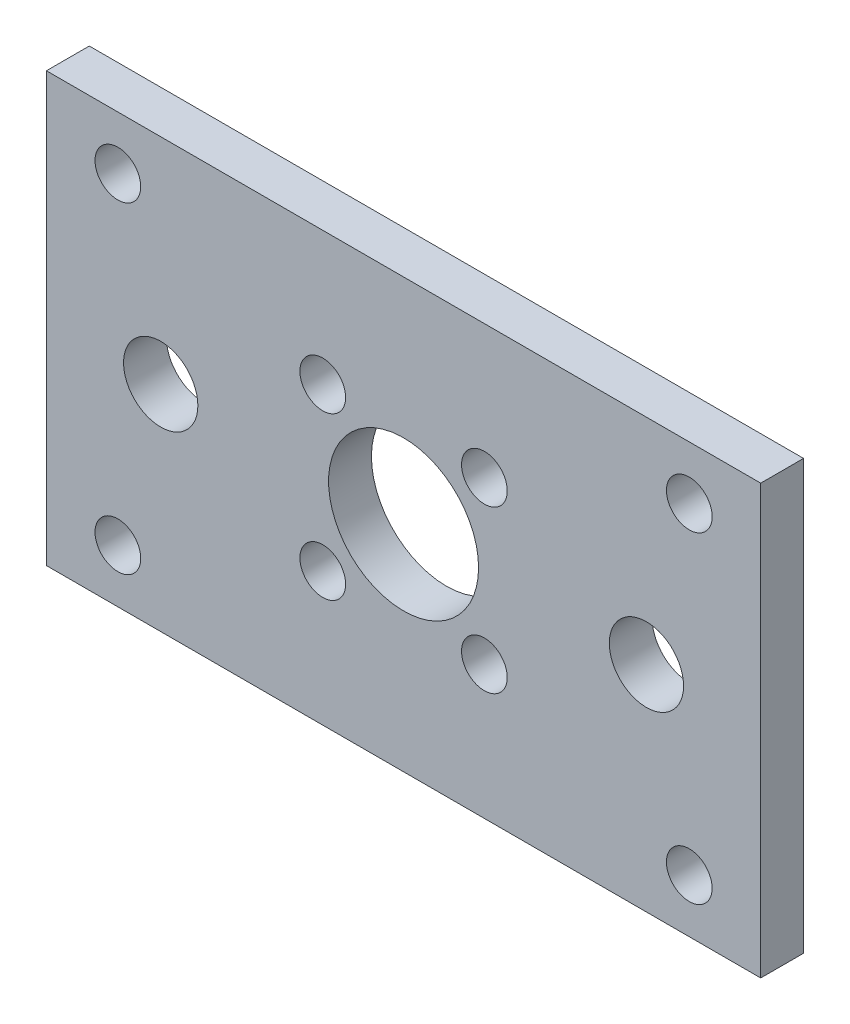
ISO-10303-21;
HEADER;
FILE_DESCRIPTION(('STEP AP214'),'2;1');
FILE_NAME('part.step','',(''),(''),'','','');
FILE_SCHEMA(('AUTOMOTIVE_DESIGN { 1 0 10303 214 1 1 1 1 }'));
ENDSEC;
DATA;
#1=APPLICATION_CONTEXT('core data for automotive mechanical design processes');
#2=APPLICATION_PROTOCOL_DEFINITION('international standard','automotive_design',2000,#1);
#3=PRODUCT_CONTEXT('',#1,'mechanical');
#4=PRODUCT('Part','Part','',(#3));
#5=PRODUCT_RELATED_PRODUCT_CATEGORY('part','',(#4));
#6=PRODUCT_DEFINITION_FORMATION('','',#4);
#7=PRODUCT_DEFINITION_CONTEXT('part definition',#1,'design');
#8=PRODUCT_DEFINITION('design','',#6,#7);
#9=PRODUCT_DEFINITION_SHAPE('','',#8);
#10=(LENGTH_UNIT() NAMED_UNIT(*) SI_UNIT(.MILLI.,.METRE.));
#11=(NAMED_UNIT(*) PLANE_ANGLE_UNIT() SI_UNIT($,.RADIAN.));
#12=(NAMED_UNIT(*) SI_UNIT($,.STERADIAN.) SOLID_ANGLE_UNIT());
#13=UNCERTAINTY_MEASURE_WITH_UNIT(LENGTH_MEASURE(1.E-05),#10,'distance_accuracy_value','');
#14=(GEOMETRIC_REPRESENTATION_CONTEXT(3) GLOBAL_UNCERTAINTY_ASSIGNED_CONTEXT((#13)) GLOBAL_UNIT_ASSIGNED_CONTEXT((#10,
#11,#12)) REPRESENTATION_CONTEXT('',''));
#15=CARTESIAN_POINT('',(0.,0.,0.));
#16=DIRECTION('',(0.,0.,1.));
#17=DIRECTION('',(1.,0.,0.));
#18=AXIS2_PLACEMENT_3D('',#15,#16,#17);
#19=CARTESIAN_POINT('',(50.,0.,3.));
#20=DIRECTION('',(0.,1.,0.));
#21=DIRECTION('',(0.,0.,1.));
#22=AXIS2_PLACEMENT_3D('',#19,#20,#21);
#23=PLANE('',#22);
#24=DIRECTION('',(1.,0.,0.));
#25=VECTOR('',#24,1.);
#26=CARTESIAN_POINT('',(50.,0.,0.));
#27=LINE('',#26,#25);
#28=CARTESIAN_POINT('',(0.,0.,0.));
#29=VERTEX_POINT('',#28);
#30=CARTESIAN_POINT('',(50.,0.,0.));
#31=VERTEX_POINT('',#30);
#32=EDGE_CURVE('E107',#29,#31,#27,.T.);
#33=ORIENTED_EDGE('',*,*,#32,.T.);
#34=DIRECTION('',(0.,0.,-1.));
#35=VECTOR('',#34,1.);
#36=CARTESIAN_POINT('',(50.,0.,3.));
#37=LINE('',#36,#35);
#38=CARTESIAN_POINT('',(50.,0.,3.));
#39=VERTEX_POINT('',#38);
#40=EDGE_CURVE('E11',#39,#31,#37,.T.);
#41=ORIENTED_EDGE('',*,*,#40,.F.);
#42=DIRECTION('',(1.,0.,0.));
#43=VECTOR('',#42,1.);
#44=CARTESIAN_POINT('',(50.,0.,3.));
#45=LINE('',#44,#43);
#46=CARTESIAN_POINT('',(0.,0.,3.));
#47=VERTEX_POINT('',#46);
#48=EDGE_CURVE('E94',#47,#39,#45,.T.);
#49=ORIENTED_EDGE('',*,*,#48,.F.);
#50=DIRECTION('',(0.,0.,-1.));
#51=VECTOR('',#50,1.);
#52=CARTESIAN_POINT('',(0.,0.,3.));
#53=LINE('',#52,#51);
#54=EDGE_CURVE('E103',#47,#29,#53,.T.);
#55=ORIENTED_EDGE('',*,*,#54,.T.);
#56=EDGE_LOOP('',(#33,#41,#49,#55));
#57=FACE_BOUND('',#56,.T.);
#58=ADVANCED_FACE('F41',(#57),#23,.F.);
#59=CARTESIAN_POINT('',(50.,0.,3.));
#60=DIRECTION('',(-1.,0.,0.));
#61=DIRECTION('',(0.,0.,1.));
#62=AXIS2_PLACEMENT_3D('',#59,#60,#61);
#63=PLANE('',#62);
#64=DIRECTION('',(0.,1.,0.));
#65=VECTOR('',#64,1.);
#66=CARTESIAN_POINT('',(50.,0.,0.));
#67=LINE('',#66,#65);
#68=CARTESIAN_POINT('',(50.,30.,0.));
#69=VERTEX_POINT('',#68);
#70=EDGE_CURVE('E98',#31,#69,#67,.T.);
#71=ORIENTED_EDGE('',*,*,#70,.T.);
#72=DIRECTION('',(0.,0.,-1.));
#73=VECTOR('',#72,1.);
#74=CARTESIAN_POINT('',(50.,30.,3.));
#75=LINE('',#74,#73);
#76=CARTESIAN_POINT('',(50.,30.,3.));
#77=VERTEX_POINT('',#76);
#78=EDGE_CURVE('E50',#77,#69,#75,.T.);
#79=ORIENTED_EDGE('',*,*,#78,.F.);
#80=DIRECTION('',(0.,1.,0.));
#81=VECTOR('',#80,1.);
#82=CARTESIAN_POINT('',(50.,0.,3.));
#83=LINE('',#82,#81);
#84=EDGE_CURVE('E89',#39,#77,#83,.T.);
#85=ORIENTED_EDGE('',*,*,#84,.F.);
#86=ORIENTED_EDGE('',*,*,#40,.T.);
#87=EDGE_LOOP('',(#71,#79,#85,#86));
#88=FACE_BOUND('',#87,.T.);
#89=ADVANCED_FACE('F97',(#88),#63,.F.);
#90=CARTESIAN_POINT('',(0.,30.,3.));
#91=DIRECTION('',(0.,-1.,0.));
#92=DIRECTION('',(1.,0.,0.));
#93=AXIS2_PLACEMENT_3D('',#90,#91,#92);
#94=PLANE('',#93);
#95=DIRECTION('',(-1.,0.,0.));
#96=VECTOR('',#95,1.);
#97=CARTESIAN_POINT('',(0.,30.,0.));
#98=LINE('',#97,#96);
#99=CARTESIAN_POINT('',(0.,30.,0.));
#100=VERTEX_POINT('',#99);
#101=EDGE_CURVE('E76',#69,#100,#98,.T.);
#102=ORIENTED_EDGE('',*,*,#101,.T.);
#103=DIRECTION('',(0.,0.,-1.));
#104=VECTOR('',#103,1.);
#105=CARTESIAN_POINT('',(0.,30.,3.));
#106=LINE('',#105,#104);
#107=CARTESIAN_POINT('',(0.,30.,3.));
#108=VERTEX_POINT('',#107);
#109=EDGE_CURVE('E99',#108,#100,#106,.T.);
#110=ORIENTED_EDGE('',*,*,#109,.F.);
#111=DIRECTION('',(-1.,0.,0.));
#112=VECTOR('',#111,1.);
#113=CARTESIAN_POINT('',(0.,30.,3.));
#114=LINE('',#113,#112);
#115=EDGE_CURVE('E92',#77,#108,#114,.T.);
#116=ORIENTED_EDGE('',*,*,#115,.F.);
#117=ORIENTED_EDGE('',*,*,#78,.T.);
#118=EDGE_LOOP('',(#102,#110,#116,#117));
#119=FACE_BOUND('',#118,.T.);
#120=ADVANCED_FACE('F101',(#119),#94,.F.);
#121=CARTESIAN_POINT('',(0.,0.,3.));
#122=DIRECTION('',(1.,0.,0.));
#123=DIRECTION('',(0.,0.,-1.));
#124=AXIS2_PLACEMENT_3D('',#121,#122,#123);
#125=PLANE('',#124);
#126=DIRECTION('',(0.,-1.,0.));
#127=VECTOR('',#126,1.);
#128=CARTESIAN_POINT('',(0.,0.,0.));
#129=LINE('',#128,#127);
#130=EDGE_CURVE('E82',#100,#29,#129,.T.);
#131=ORIENTED_EDGE('',*,*,#130,.T.);
#132=ORIENTED_EDGE('',*,*,#54,.F.);
#133=DIRECTION('',(0.,-1.,0.));
#134=VECTOR('',#133,1.);
#135=CARTESIAN_POINT('',(0.,0.,3.));
#136=LINE('',#135,#134);
#137=EDGE_CURVE('E59',#108,#47,#136,.T.);
#138=ORIENTED_EDGE('',*,*,#137,.F.);
#139=ORIENTED_EDGE('',*,*,#109,.T.);
#140=EDGE_LOOP('',(#131,#132,#138,#139));
#141=FACE_BOUND('',#140,.T.);
#142=ADVANCED_FACE('F178',(#141),#125,.F.);
#143=CARTESIAN_POINT('',(0.,0.,3.));
#144=DIRECTION('',(0.,0.,-1.));
#145=DIRECTION('',(-1.,0.,0.));
#146=AXIS2_PLACEMENT_3D('',#143,#144,#145);
#147=PLANE('',#146);
#148=CARTESIAN_POINT('',(5.,3.73460370541701,3.));
#149=DIRECTION('',(0.,0.,1.));
#150=DIRECTION('',(-1.,0.,0.));
#151=AXIS2_PLACEMENT_3D('',#148,#149,#150);
#152=CIRCLE('',#151,1.6);
#153=CARTESIAN_POINT('',(3.40000000000001,3.73460370541701,3.));
#154=VERTEX_POINT('',#153);
#155=EDGE_CURVE('E331',#154,#154,#152,.T.);
#156=ORIENTED_EDGE('',*,*,#155,.F.);
#157=EDGE_LOOP('',(#156));
#158=FACE_BOUND('',#157,.T.);
#159=CARTESIAN_POINT('',(5.,26.265396294583,3.));
#160=DIRECTION('',(0.,0.,1.));
#161=DIRECTION('',(1.,0.,0.));
#162=AXIS2_PLACEMENT_3D('',#159,#160,#161);
#163=CIRCLE('',#162,1.6);
#164=CARTESIAN_POINT('',(6.6,26.265396294583,3.));
#165=VERTEX_POINT('',#164);
#166=EDGE_CURVE('E328',#165,#165,#163,.T.);
#167=ORIENTED_EDGE('',*,*,#166,.F.);
#168=EDGE_LOOP('',(#167));
#169=FACE_BOUND('',#168,.T.);
#170=CARTESIAN_POINT('',(25.,15.,3.));
#171=DIRECTION('',(0.,0.,1.));
#172=DIRECTION('',(1.,0.,0.));
#173=AXIS2_PLACEMENT_3D('',#170,#171,#172);
#174=CIRCLE('',#173,5.25);
#175=CARTESIAN_POINT('',(30.25,15.,3.));
#176=VERTEX_POINT('',#175);
#177=EDGE_CURVE('E350',#176,#176,#174,.T.);
#178=ORIENTED_EDGE('',*,*,#177,.F.);
#179=EDGE_LOOP('',(#178));
#180=FACE_BOUND('',#179,.T.);
#181=CARTESIAN_POINT('',(30.6568542494924,9.34314575050758,3.));
#182=DIRECTION('',(0.,0.,1.));
#183=DIRECTION('',(1.,0.,0.));
#184=AXIS2_PLACEMENT_3D('',#181,#182,#183);
#185=CIRCLE('',#184,1.60000000000001);
#186=CARTESIAN_POINT('',(32.2568542494924,9.34314575050758,3.));
#187=VERTEX_POINT('',#186);
#188=EDGE_CURVE('E354',#187,#187,#185,.T.);
#189=ORIENTED_EDGE('',*,*,#188,.F.);
#190=EDGE_LOOP('',(#189));
#191=FACE_BOUND('',#190,.T.);
#192=CARTESIAN_POINT('',(30.6568542494924,20.6568542494923,3.));
#193=DIRECTION('',(0.,0.,1.));
#194=DIRECTION('',(1.,0.,0.));
#195=AXIS2_PLACEMENT_3D('',#192,#193,#194);
#196=CIRCLE('',#195,1.6);
#197=CARTESIAN_POINT('',(32.2568542494924,20.6568542494923,3.));
#198=VERTEX_POINT('',#197);
#199=EDGE_CURVE('E339',#198,#198,#196,.T.);
#200=ORIENTED_EDGE('',*,*,#199,.F.);
#201=EDGE_LOOP('',(#200));
#202=FACE_BOUND('',#201,.T.);
#203=CARTESIAN_POINT('',(42.,15.,3.));
#204=DIRECTION('',(0.,0.,1.));
#205=DIRECTION('',(1.,0.,0.));
#206=AXIS2_PLACEMENT_3D('',#203,#204,#205);
#207=CIRCLE('',#206,2.6);
#208=CARTESIAN_POINT('',(44.6,15.,3.));
#209=VERTEX_POINT('',#208);
#210=EDGE_CURVE('E343',#209,#209,#207,.T.);
#211=ORIENTED_EDGE('',*,*,#210,.F.);
#212=EDGE_LOOP('',(#211));
#213=FACE_BOUND('',#212,.T.);
#214=CARTESIAN_POINT('',(19.3431457505076,9.34314575050764,3.));
#215=DIRECTION('',(0.,0.,1.));
#216=DIRECTION('',(1.,0.,0.));
#217=AXIS2_PLACEMENT_3D('',#214,#215,#216);
#218=CIRCLE('',#217,1.6);
#219=CARTESIAN_POINT('',(20.9431457505076,9.34314575050764,3.));
#220=VERTEX_POINT('',#219);
#221=EDGE_CURVE('E356',#220,#220,#218,.T.);
#222=ORIENTED_EDGE('',*,*,#221,.F.);
#223=EDGE_LOOP('',(#222));
#224=FACE_BOUND('',#223,.T.);
#225=CARTESIAN_POINT('',(19.3431457505076,20.6568542494924,3.));
#226=DIRECTION('',(0.,0.,1.));
#227=DIRECTION('',(1.,0.,0.));
#228=AXIS2_PLACEMENT_3D('',#225,#226,#227);
#229=CIRCLE('',#228,1.6);
#230=CARTESIAN_POINT('',(20.9431457505077,20.6568542494924,3.));
#231=VERTEX_POINT('',#230);
#232=EDGE_CURVE('E360',#231,#231,#229,.T.);
#233=ORIENTED_EDGE('',*,*,#232,.F.);
#234=EDGE_LOOP('',(#233));
#235=FACE_BOUND('',#234,.T.);
#236=CARTESIAN_POINT('',(45.,3.73460370541701,3.));
#237=DIRECTION('',(0.,0.,1.));
#238=DIRECTION('',(1.,0.,0.));
#239=AXIS2_PLACEMENT_3D('',#236,#237,#238);
#240=CIRCLE('',#239,1.6);
#241=CARTESIAN_POINT('',(46.6,3.73460370541701,3.));
#242=VERTEX_POINT('',#241);
#243=EDGE_CURVE('E334',#242,#242,#240,.T.);
#244=ORIENTED_EDGE('',*,*,#243,.F.);
#245=EDGE_LOOP('',(#244));
#246=FACE_BOUND('',#245,.T.);
#247=CARTESIAN_POINT('',(45.,26.265396294583,3.));
#248=DIRECTION('',(0.,0.,1.));
#249=DIRECTION('',(-1.,0.,0.));
#250=AXIS2_PLACEMENT_3D('',#247,#248,#249);
#251=CIRCLE('',#250,1.6);
#252=CARTESIAN_POINT('',(43.4,26.265396294583,3.));
#253=VERTEX_POINT('',#252);
#254=EDGE_CURVE('E330',#253,#253,#251,.T.);
#255=ORIENTED_EDGE('',*,*,#254,.F.);
#256=EDGE_LOOP('',(#255));
#257=FACE_BOUND('',#256,.T.);
#258=CARTESIAN_POINT('',(8.,15.,3.));
#259=DIRECTION('',(0.,0.,1.));
#260=DIRECTION('',(1.,0.,0.));
#261=AXIS2_PLACEMENT_3D('',#258,#259,#260);
#262=CIRCLE('',#261,2.6);
#263=CARTESIAN_POINT('',(10.6,15.,3.));
#264=VERTEX_POINT('',#263);
#265=EDGE_CURVE('E119',#264,#264,#262,.T.);
#266=ORIENTED_EDGE('',*,*,#265,.F.);
#267=EDGE_LOOP('',(#266));
#268=FACE_BOUND('',#267,.T.);
#269=ORIENTED_EDGE('',*,*,#48,.T.);
#270=ORIENTED_EDGE('',*,*,#84,.T.);
#271=ORIENTED_EDGE('',*,*,#115,.T.);
#272=ORIENTED_EDGE('',*,*,#137,.T.);
#273=EDGE_LOOP('',(#269,#270,#271,#272));
#274=FACE_BOUND('',#273,.T.);
#275=ADVANCED_FACE('F90',(#158,#169,#180,#191,#202,#213,#224,#235,#246,#257,#268,#274),#147,.F.);
#276=CARTESIAN_POINT('',(0.,0.,0.));
#277=DIRECTION('',(0.,0.,-1.));
#278=DIRECTION('',(-1.,0.,0.));
#279=AXIS2_PLACEMENT_3D('',#276,#277,#278);
#280=PLANE('',#279);
#281=CARTESIAN_POINT('',(5.,3.73460370541701,0.));
#282=DIRECTION('',(0.,0.,-1.));
#283=DIRECTION('',(-1.,0.,0.));
#284=AXIS2_PLACEMENT_3D('',#281,#282,#283);
#285=CIRCLE('',#284,1.6);
#286=CARTESIAN_POINT('',(3.40000000000001,3.73460370541701,0.));
#287=VERTEX_POINT('',#286);
#288=EDGE_CURVE('E44',#287,#287,#285,.T.);
#289=ORIENTED_EDGE('',*,*,#288,.F.);
#290=EDGE_LOOP('',(#289));
#291=FACE_BOUND('',#290,.T.);
#292=CARTESIAN_POINT('',(5.,26.265396294583,0.));
#293=DIRECTION('',(0.,0.,-1.));
#294=DIRECTION('',(-1.,0.,0.));
#295=AXIS2_PLACEMENT_3D('',#292,#293,#294);
#296=CIRCLE('',#295,1.6);
#297=CARTESIAN_POINT('',(3.4,26.265396294583,0.));
#298=VERTEX_POINT('',#297);
#299=EDGE_CURVE('E142',#298,#298,#296,.T.);
#300=ORIENTED_EDGE('',*,*,#299,.F.);
#301=EDGE_LOOP('',(#300));
#302=FACE_BOUND('',#301,.T.);
#303=CARTESIAN_POINT('',(25.,15.,0.));
#304=DIRECTION('',(0.,0.,-1.));
#305=DIRECTION('',(-1.,0.,0.));
#306=AXIS2_PLACEMENT_3D('',#303,#304,#305);
#307=CIRCLE('',#306,5.25);
#308=CARTESIAN_POINT('',(19.75,15.,0.));
#309=VERTEX_POINT('',#308);
#310=EDGE_CURVE('E140',#309,#309,#307,.T.);
#311=ORIENTED_EDGE('',*,*,#310,.F.);
#312=EDGE_LOOP('',(#311));
#313=FACE_BOUND('',#312,.T.);
#314=CARTESIAN_POINT('',(30.6568542494924,9.34314575050758,0.));
#315=DIRECTION('',(0.,0.,-1.));
#316=DIRECTION('',(-1.,0.,0.));
#317=AXIS2_PLACEMENT_3D('',#314,#315,#316);
#318=CIRCLE('',#317,1.60000000000001);
#319=CARTESIAN_POINT('',(29.0568542494923,9.34314575050758,0.));
#320=VERTEX_POINT('',#319);
#321=EDGE_CURVE('E137',#320,#320,#318,.T.);
#322=ORIENTED_EDGE('',*,*,#321,.F.);
#323=EDGE_LOOP('',(#322));
#324=FACE_BOUND('',#323,.T.);
#325=CARTESIAN_POINT('',(30.6568542494924,20.6568542494923,0.));
#326=DIRECTION('',(0.,0.,-1.));
#327=DIRECTION('',(-1.,0.,0.));
#328=AXIS2_PLACEMENT_3D('',#325,#326,#327);
#329=CIRCLE('',#328,1.6);
#330=CARTESIAN_POINT('',(29.0568542494924,20.6568542494923,0.));
#331=VERTEX_POINT('',#330);
#332=EDGE_CURVE('E134',#331,#331,#329,.T.);
#333=ORIENTED_EDGE('',*,*,#332,.F.);
#334=EDGE_LOOP('',(#333));
#335=FACE_BOUND('',#334,.T.);
#336=CARTESIAN_POINT('',(42.,15.,0.));
#337=DIRECTION('',(0.,0.,-1.));
#338=DIRECTION('',(-1.,0.,0.));
#339=AXIS2_PLACEMENT_3D('',#336,#337,#338);
#340=CIRCLE('',#339,2.6);
#341=CARTESIAN_POINT('',(39.4,15.,0.));
#342=VERTEX_POINT('',#341);
#343=EDGE_CURVE('E131',#342,#342,#340,.T.);
#344=ORIENTED_EDGE('',*,*,#343,.F.);
#345=EDGE_LOOP('',(#344));
#346=FACE_BOUND('',#345,.T.);
#347=CARTESIAN_POINT('',(19.3431457505076,9.34314575050764,0.));
#348=DIRECTION('',(0.,0.,-1.));
#349=DIRECTION('',(-1.,0.,0.));
#350=AXIS2_PLACEMENT_3D('',#347,#348,#349);
#351=CIRCLE('',#350,1.6);
#352=CARTESIAN_POINT('',(17.7431457505076,9.34314575050764,0.));
#353=VERTEX_POINT('',#352);
#354=EDGE_CURVE('E128',#353,#353,#351,.T.);
#355=ORIENTED_EDGE('',*,*,#354,.F.);
#356=EDGE_LOOP('',(#355));
#357=FACE_BOUND('',#356,.T.);
#358=CARTESIAN_POINT('',(19.3431457505076,20.6568542494924,0.));
#359=DIRECTION('',(0.,0.,-1.));
#360=DIRECTION('',(-1.,0.,0.));
#361=AXIS2_PLACEMENT_3D('',#358,#359,#360);
#362=CIRCLE('',#361,1.6);
#363=CARTESIAN_POINT('',(17.7431457505076,20.6568542494924,0.));
#364=VERTEX_POINT('',#363);
#365=EDGE_CURVE('E125',#364,#364,#362,.T.);
#366=ORIENTED_EDGE('',*,*,#365,.F.);
#367=EDGE_LOOP('',(#366));
#368=FACE_BOUND('',#367,.T.);
#369=CARTESIAN_POINT('',(45.,3.73460370541701,0.));
#370=DIRECTION('',(0.,0.,-1.));
#371=DIRECTION('',(-1.,0.,0.));
#372=AXIS2_PLACEMENT_3D('',#369,#370,#371);
#373=CIRCLE('',#372,1.6);
#374=CARTESIAN_POINT('',(43.4,3.73460370541701,0.));
#375=VERTEX_POINT('',#374);
#376=EDGE_CURVE('E122',#375,#375,#373,.T.);
#377=ORIENTED_EDGE('',*,*,#376,.F.);
#378=EDGE_LOOP('',(#377));
#379=FACE_BOUND('',#378,.T.);
#380=CARTESIAN_POINT('',(45.,26.265396294583,0.));
#381=DIRECTION('',(0.,0.,-1.));
#382=DIRECTION('',(-1.,0.,0.));
#383=AXIS2_PLACEMENT_3D('',#380,#381,#382);
#384=CIRCLE('',#383,1.6);
#385=CARTESIAN_POINT('',(43.4,26.265396294583,0.));
#386=VERTEX_POINT('',#385);
#387=EDGE_CURVE('E118',#386,#386,#384,.T.);
#388=ORIENTED_EDGE('',*,*,#387,.F.);
#389=EDGE_LOOP('',(#388));
#390=FACE_BOUND('',#389,.T.);
#391=CARTESIAN_POINT('',(8.,15.,0.));
#392=DIRECTION('',(0.,0.,-1.));
#393=DIRECTION('',(-1.,0.,0.));
#394=AXIS2_PLACEMENT_3D('',#391,#392,#393);
#395=CIRCLE('',#394,2.6);
#396=CARTESIAN_POINT('',(5.4,15.,0.));
#397=VERTEX_POINT('',#396);
#398=EDGE_CURVE('E115',#397,#397,#395,.T.);
#399=ORIENTED_EDGE('',*,*,#398,.F.);
#400=EDGE_LOOP('',(#399));
#401=FACE_BOUND('',#400,.T.);
#402=ORIENTED_EDGE('',*,*,#32,.F.);
#403=ORIENTED_EDGE('',*,*,#130,.F.);
#404=ORIENTED_EDGE('',*,*,#101,.F.);
#405=ORIENTED_EDGE('',*,*,#70,.F.);
#406=EDGE_LOOP('',(#402,#403,#404,#405));
#407=FACE_BOUND('',#406,.T.);
#408=ADVANCED_FACE('F152',(#291,#302,#313,#324,#335,#346,#357,#368,#379,#390,#401,#407),#280,.T.);
#409=CARTESIAN_POINT('',(8.,15.,-2.));
#410=DIRECTION('',(0.,0.,1.));
#411=DIRECTION('',(1.,0.,0.));
#412=AXIS2_PLACEMENT_3D('',#409,#410,#411);
#413=CYLINDRICAL_SURFACE('',#412,2.6);
#414=ORIENTED_EDGE('',*,*,#398,.T.);
#415=EDGE_LOOP('',(#414));
#416=FACE_BOUND('',#415,.T.);
#417=ORIENTED_EDGE('',*,*,#265,.T.);
#418=EDGE_LOOP('',(#417));
#419=FACE_BOUND('',#418,.T.);
#420=ADVANCED_FACE('F155',(#416,#419),#413,.F.);
#421=CARTESIAN_POINT('',(45.,26.265396294583,-2.));
#422=DIRECTION('',(0.,0.,1.));
#423=DIRECTION('',(1.,0.,0.));
#424=AXIS2_PLACEMENT_3D('',#421,#422,#423);
#425=CYLINDRICAL_SURFACE('',#424,1.6);
#426=ORIENTED_EDGE('',*,*,#387,.T.);
#427=EDGE_LOOP('',(#426));
#428=FACE_BOUND('',#427,.T.);
#429=ORIENTED_EDGE('',*,*,#254,.T.);
#430=EDGE_LOOP('',(#429));
#431=FACE_BOUND('',#430,.T.);
#432=ADVANCED_FACE('F225',(#428,#431),#425,.F.);
#433=CARTESIAN_POINT('',(45.,3.73460370541701,-2.));
#434=DIRECTION('',(0.,0.,1.));
#435=DIRECTION('',(1.,0.,0.));
#436=AXIS2_PLACEMENT_3D('',#433,#434,#435);
#437=CYLINDRICAL_SURFACE('',#436,1.6);
#438=ORIENTED_EDGE('',*,*,#376,.T.);
#439=EDGE_LOOP('',(#438));
#440=FACE_BOUND('',#439,.T.);
#441=ORIENTED_EDGE('',*,*,#243,.T.);
#442=EDGE_LOOP('',(#441));
#443=FACE_BOUND('',#442,.T.);
#444=ADVANCED_FACE('F235',(#440,#443),#437,.F.);
#445=CARTESIAN_POINT('',(19.3431457505076,20.6568542494924,-2.));
#446=DIRECTION('',(0.,0.,1.));
#447=DIRECTION('',(1.,0.,0.));
#448=AXIS2_PLACEMENT_3D('',#445,#446,#447);
#449=CYLINDRICAL_SURFACE('',#448,1.6);
#450=ORIENTED_EDGE('',*,*,#365,.T.);
#451=EDGE_LOOP('',(#450));
#452=FACE_BOUND('',#451,.T.);
#453=ORIENTED_EDGE('',*,*,#232,.T.);
#454=EDGE_LOOP('',(#453));
#455=FACE_BOUND('',#454,.T.);
#456=ADVANCED_FACE('F245',(#452,#455),#449,.F.);
#457=CARTESIAN_POINT('',(19.3431457505076,9.34314575050764,-2.));
#458=DIRECTION('',(0.,0.,1.));
#459=DIRECTION('',(1.,0.,0.));
#460=AXIS2_PLACEMENT_3D('',#457,#458,#459);
#461=CYLINDRICAL_SURFACE('',#460,1.6);
#462=ORIENTED_EDGE('',*,*,#354,.T.);
#463=EDGE_LOOP('',(#462));
#464=FACE_BOUND('',#463,.T.);
#465=ORIENTED_EDGE('',*,*,#221,.T.);
#466=EDGE_LOOP('',(#465));
#467=FACE_BOUND('',#466,.T.);
#468=ADVANCED_FACE('F255',(#464,#467),#461,.F.);
#469=CARTESIAN_POINT('',(42.,15.,-2.));
#470=DIRECTION('',(0.,0.,1.));
#471=DIRECTION('',(1.,0.,0.));
#472=AXIS2_PLACEMENT_3D('',#469,#470,#471);
#473=CYLINDRICAL_SURFACE('',#472,2.6);
#474=ORIENTED_EDGE('',*,*,#343,.T.);
#475=EDGE_LOOP('',(#474));
#476=FACE_BOUND('',#475,.T.);
#477=ORIENTED_EDGE('',*,*,#210,.T.);
#478=EDGE_LOOP('',(#477));
#479=FACE_BOUND('',#478,.T.);
#480=ADVANCED_FACE('F265',(#476,#479),#473,.F.);
#481=CARTESIAN_POINT('',(30.6568542494924,20.6568542494923,-2.));
#482=DIRECTION('',(0.,0.,1.));
#483=DIRECTION('',(1.,0.,0.));
#484=AXIS2_PLACEMENT_3D('',#481,#482,#483);
#485=CYLINDRICAL_SURFACE('',#484,1.6);
#486=ORIENTED_EDGE('',*,*,#332,.T.);
#487=EDGE_LOOP('',(#486));
#488=FACE_BOUND('',#487,.T.);
#489=ORIENTED_EDGE('',*,*,#199,.T.);
#490=EDGE_LOOP('',(#489));
#491=FACE_BOUND('',#490,.T.);
#492=ADVANCED_FACE('F275',(#488,#491),#485,.F.);
#493=CARTESIAN_POINT('',(30.6568542494924,9.34314575050758,-2.));
#494=DIRECTION('',(0.,0.,1.));
#495=DIRECTION('',(1.,0.,0.));
#496=AXIS2_PLACEMENT_3D('',#493,#494,#495);
#497=CYLINDRICAL_SURFACE('',#496,1.60000000000001);
#498=ORIENTED_EDGE('',*,*,#321,.T.);
#499=EDGE_LOOP('',(#498));
#500=FACE_BOUND('',#499,.T.);
#501=ORIENTED_EDGE('',*,*,#188,.T.);
#502=EDGE_LOOP('',(#501));
#503=FACE_BOUND('',#502,.T.);
#504=ADVANCED_FACE('F285',(#500,#503),#497,.F.);
#505=CARTESIAN_POINT('',(25.,15.,-2.));
#506=DIRECTION('',(0.,0.,1.));
#507=DIRECTION('',(1.,0.,0.));
#508=AXIS2_PLACEMENT_3D('',#505,#506,#507);
#509=CYLINDRICAL_SURFACE('',#508,5.25);
#510=ORIENTED_EDGE('',*,*,#310,.T.);
#511=EDGE_LOOP('',(#510));
#512=FACE_BOUND('',#511,.T.);
#513=ORIENTED_EDGE('',*,*,#177,.T.);
#514=EDGE_LOOP('',(#513));
#515=FACE_BOUND('',#514,.T.);
#516=ADVANCED_FACE('F295',(#512,#515),#509,.F.);
#517=CARTESIAN_POINT('',(5.,26.265396294583,-2.));
#518=DIRECTION('',(0.,0.,1.));
#519=DIRECTION('',(1.,0.,0.));
#520=AXIS2_PLACEMENT_3D('',#517,#518,#519);
#521=CYLINDRICAL_SURFACE('',#520,1.6);
#522=ORIENTED_EDGE('',*,*,#299,.T.);
#523=EDGE_LOOP('',(#522));
#524=FACE_BOUND('',#523,.T.);
#525=ORIENTED_EDGE('',*,*,#166,.T.);
#526=EDGE_LOOP('',(#525));
#527=FACE_BOUND('',#526,.T.);
#528=ADVANCED_FACE('F305',(#524,#527),#521,.F.);
#529=CARTESIAN_POINT('',(5.,3.73460370541701,-2.));
#530=DIRECTION('',(0.,0.,1.));
#531=DIRECTION('',(1.,0.,0.));
#532=AXIS2_PLACEMENT_3D('',#529,#530,#531);
#533=CYLINDRICAL_SURFACE('',#532,1.6);
#534=ORIENTED_EDGE('',*,*,#288,.T.);
#535=EDGE_LOOP('',(#534));
#536=FACE_BOUND('',#535,.T.);
#537=ORIENTED_EDGE('',*,*,#155,.T.);
#538=EDGE_LOOP('',(#537));
#539=FACE_BOUND('',#538,.T.);
#540=ADVANCED_FACE('F149',(#536,#539),#533,.F.);
#541=CLOSED_SHELL('',(#58,#89,#120,#142,#275,#408,#420,#432,#444,#456,#468,#480,#492,#504,#516,
#528,#540));
#542=MANIFOLD_SOLID_BREP('B2',#541);
#543=ADVANCED_BREP_SHAPE_REPRESENTATION('',(#18,#542),#14);
#544=SHAPE_DEFINITION_REPRESENTATION(#9,#543);
ENDSEC;
END-ISO-10303-21;
